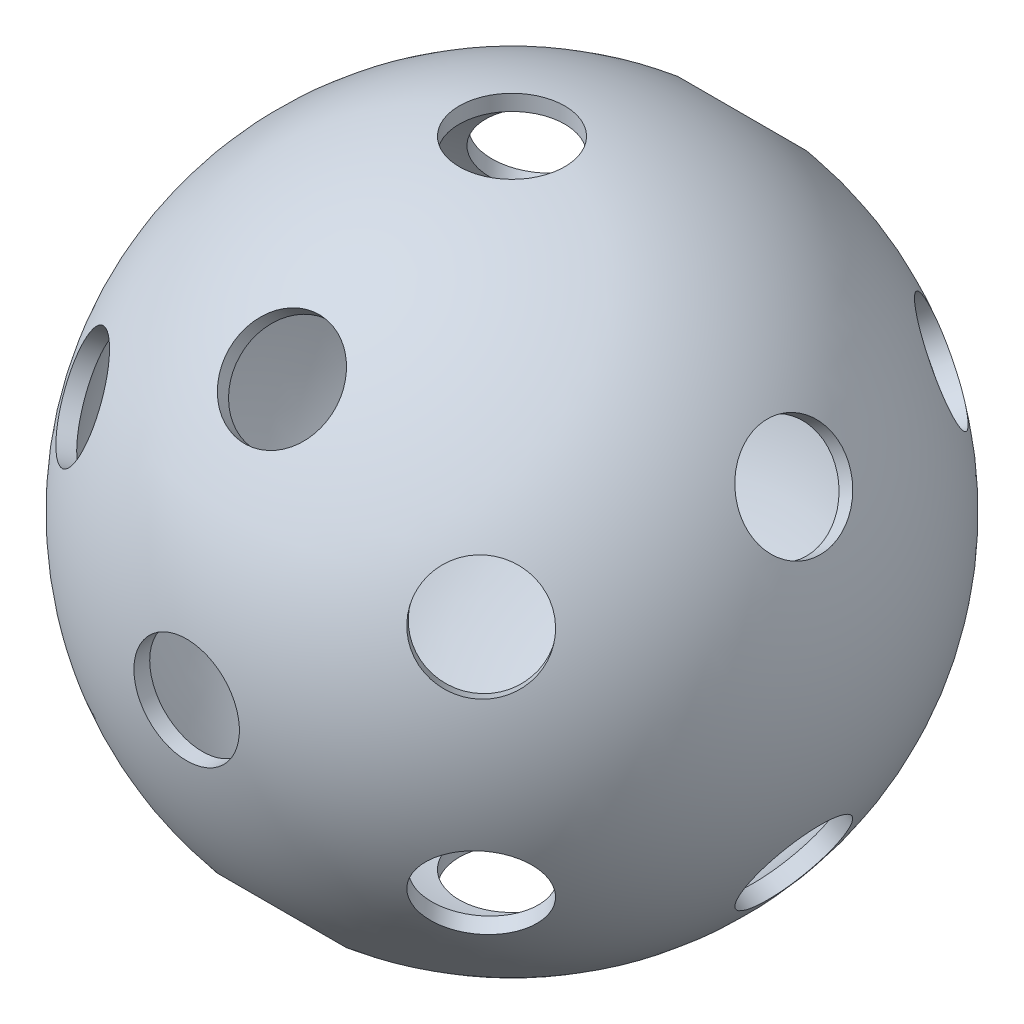
ISO-10303-21;
HEADER;
FILE_DESCRIPTION(('STEP AP214'),'2;1');
FILE_NAME('part.step','',(''),(''),'','','');
FILE_SCHEMA(('AUTOMOTIVE_DESIGN { 1 0 10303 214 1 1 1 1 }'));
ENDSEC;
DATA;
#1=APPLICATION_CONTEXT('core data for automotive mechanical design processes');
#2=APPLICATION_PROTOCOL_DEFINITION('international standard','automotive_design',2000,#1);
#3=PRODUCT_CONTEXT('',#1,'mechanical');
#4=PRODUCT('Part','Part','',(#3));
#5=PRODUCT_RELATED_PRODUCT_CATEGORY('part','',(#4));
#6=PRODUCT_DEFINITION_FORMATION('','',#4);
#7=PRODUCT_DEFINITION_CONTEXT('part definition',#1,'design');
#8=PRODUCT_DEFINITION('design','',#6,#7);
#9=PRODUCT_DEFINITION_SHAPE('','',#8);
#10=(LENGTH_UNIT() NAMED_UNIT(*) SI_UNIT(.MILLI.,.METRE.));
#11=(NAMED_UNIT(*) PLANE_ANGLE_UNIT() SI_UNIT($,.RADIAN.));
#12=(NAMED_UNIT(*) SI_UNIT($,.STERADIAN.) SOLID_ANGLE_UNIT());
#13=UNCERTAINTY_MEASURE_WITH_UNIT(LENGTH_MEASURE(1.E-05),#10,'distance_accuracy_value','');
#14=(GEOMETRIC_REPRESENTATION_CONTEXT(3) GLOBAL_UNCERTAINTY_ASSIGNED_CONTEXT((#13)) GLOBAL_UNIT_ASSIGNED_CONTEXT((#10,
#11,#12)) REPRESENTATION_CONTEXT('',''));
#15=CARTESIAN_POINT('',(0.,0.,0.));
#16=DIRECTION('',(0.,0.,1.));
#17=DIRECTION('',(1.,0.,0.));
#18=AXIS2_PLACEMENT_3D('',#15,#16,#17);
#19=CARTESIAN_POINT('',(0.,0.,0.));
#20=DIRECTION('',(0.,1.,0.));
#21=DIRECTION('',(1.,0.,0.));
#22=AXIS2_PLACEMENT_3D('',#19,#20,#21);
#23=SPHERICAL_SURFACE('',#22,60.5);
#24=CARTESIAN_POINT('',(0.,0.,59.6407947633162));
#25=DIRECTION('',(0.,0.,-1.));
#26=DIRECTION('',(-1.,0.,0.));
#27=AXIS2_PLACEMENT_3D('',#24,#25,#26);
#28=CIRCLE('',#27,10.16);
#29=CARTESIAN_POINT('',(-10.16,0.,59.6407947633162));
#30=VERTEX_POINT('',#29);
#31=EDGE_CURVE('E36',#30,#30,#28,.T.);
#32=ORIENTED_EDGE('',*,*,#31,.F.);
#33=EDGE_LOOP('',(#32));
#34=FACE_BOUND('',#33,.T.);
#35=CARTESIAN_POINT('',(0.,-42.1724104124961,42.1724104124959));
#36=DIRECTION('',(0.,0.707106781186549,-0.707106781186546));
#37=DIRECTION('',(-1.,0.,0.));
#38=AXIS2_PLACEMENT_3D('',#35,#36,#37);
#39=CIRCLE('',#38,10.16);
#40=CARTESIAN_POINT('',(-10.16,-42.1724104124961,42.1724104124959));
#41=VERTEX_POINT('',#40);
#42=EDGE_CURVE('E43',#41,#41,#39,.T.);
#43=ORIENTED_EDGE('',*,*,#42,.F.);
#44=EDGE_LOOP('',(#43));
#45=FACE_BOUND('',#44,.T.);
#46=CARTESIAN_POINT('',(0.,42.1724104124955,42.1724104124965));
#47=DIRECTION('',(0.,-0.707106781186539,-0.707106781186556));
#48=DIRECTION('',(-1.,0.,0.));
#49=AXIS2_PLACEMENT_3D('',#46,#47,#48);
#50=CIRCLE('',#49,10.16);
#51=CARTESIAN_POINT('',(-10.16,42.1724104124955,42.1724104124965));
#52=VERTEX_POINT('',#51);
#53=EDGE_CURVE('E51',#52,#52,#50,.T.);
#54=ORIENTED_EDGE('',*,*,#53,.F.);
#55=EDGE_LOOP('',(#54));
#56=FACE_BOUND('',#55,.T.);
#57=CARTESIAN_POINT('',(0.,59.6407947633162,6.17765271945768E-13));
#58=DIRECTION('',(0.,-1.,0.));
#59=DIRECTION('',(-1.,0.,0.));
#60=AXIS2_PLACEMENT_3D('',#57,#58,#59);
#61=CIRCLE('',#60,10.16);
#62=CARTESIAN_POINT('',(-10.16,59.6407947633162,6.19009513093701E-13));
#63=VERTEX_POINT('',#62);
#64=EDGE_CURVE('E59',#63,#63,#61,.T.);
#65=ORIENTED_EDGE('',*,*,#64,.F.);
#66=EDGE_LOOP('',(#65));
#67=FACE_BOUND('',#66,.T.);
#68=CARTESIAN_POINT('',(0.,42.1724104124963,-42.1724104124956));
#69=DIRECTION('',(0.,-0.707106781186554,0.707106781186541));
#70=DIRECTION('',(-1.,0.,0.));
#71=AXIS2_PLACEMENT_3D('',#68,#69,#70);
#72=CIRCLE('',#71,10.16);
#73=CARTESIAN_POINT('',(-10.16,42.1724104124963,-42.1724104124956));
#74=VERTEX_POINT('',#73);
#75=EDGE_CURVE('E65',#74,#74,#72,.T.);
#76=ORIENTED_EDGE('',*,*,#75,.F.);
#77=EDGE_LOOP('',(#76));
#78=FACE_BOUND('',#77,.T.);
#79=CARTESIAN_POINT('',(0.,0.,-59.6407947633162));
#80=DIRECTION('',(0.,0.,1.));
#81=DIRECTION('',(-1.,0.,0.));
#82=AXIS2_PLACEMENT_3D('',#79,#80,#81);
#83=CIRCLE('',#82,10.16);
#84=CARTESIAN_POINT('',(-10.16,0.,-59.6407947633162));
#85=VERTEX_POINT('',#84);
#86=EDGE_CURVE('E71',#85,#85,#83,.T.);
#87=ORIENTED_EDGE('',*,*,#86,.F.);
#88=EDGE_LOOP('',(#87));
#89=FACE_BOUND('',#88,.T.);
#90=CARTESIAN_POINT('',(0.,-42.1724104124958,-42.1724104124962));
#91=DIRECTION('',(0.,0.707106781186544,0.707106781186551));
#92=DIRECTION('',(-1.,0.,0.));
#93=AXIS2_PLACEMENT_3D('',#90,#91,#92);
#94=CIRCLE('',#93,10.16);
#95=CARTESIAN_POINT('',(-10.16,-42.1724104124958,-42.1724104124962));
#96=VERTEX_POINT('',#95);
#97=EDGE_CURVE('E77',#96,#96,#94,.T.);
#98=ORIENTED_EDGE('',*,*,#97,.F.);
#99=EDGE_LOOP('',(#98));
#100=FACE_BOUND('',#99,.T.);
#101=CARTESIAN_POINT('',(0.,-59.6407947633162,-2.01295828045984E-13));
#102=DIRECTION('',(0.,1.,0.));
#103=DIRECTION('',(-1.,0.,0.));
#104=AXIS2_PLACEMENT_3D('',#101,#102,#103);
#105=CIRCLE('',#104,10.16);
#106=CARTESIAN_POINT('',(-10.16,-59.6407947633162,-2.00051586898051E-13));
#107=VERTEX_POINT('',#106);
#108=EDGE_CURVE('E50',#107,#107,#105,.T.);
#109=ORIENTED_EDGE('',*,*,#108,.F.);
#110=EDGE_LOOP('',(#109));
#111=FACE_BOUND('',#110,.T.);
#112=CARTESIAN_POINT('',(51.6504433669258,-29.820397381658,-2.01295828045984E-13));
#113=DIRECTION('',(-0.86602540378444,0.499999999999998,0.));
#114=DIRECTION('',(-0.499999999999998,-0.86602540378444,0.));
#115=AXIS2_PLACEMENT_3D('',#112,#113,#114);
#116=CIRCLE('',#115,10.16);
#117=CARTESIAN_POINT('',(46.5704433669258,-38.6192154841079,-2.00051586898051E-13));
#118=VERTEX_POINT('',#117);
#119=EDGE_CURVE('E58',#118,#118,#116,.T.);
#120=ORIENTED_EDGE('',*,*,#119,.F.);
#121=EDGE_LOOP('',(#120));
#122=FACE_BOUND('',#121,.T.);
#123=CARTESIAN_POINT('',(-51.6504433669254,-29.8203973816587,-2.01295828045984E-13));
#124=DIRECTION('',(0.866025403784433,0.50000000000001,0.));
#125=DIRECTION('',(-0.50000000000001,0.866025403784433,0.));
#126=AXIS2_PLACEMENT_3D('',#123,#124,#125);
#127=CIRCLE('',#126,10.16);
#128=CARTESIAN_POINT('',(-56.7304433669255,-21.0215792792088,-2.00051586898051E-13));
#129=VERTEX_POINT('',#128);
#130=EDGE_CURVE('E93',#129,#129,#127,.T.);
#131=ORIENTED_EDGE('',*,*,#130,.F.);
#132=EDGE_LOOP('',(#131));
#133=FACE_BOUND('',#132,.T.);
#134=CARTESIAN_POINT('',(-51.650443366926,29.8203973816576,-2.01295828045984E-13));
#135=DIRECTION('',(0.866025403784443,-0.499999999999992,0.));
#136=DIRECTION('',(0.499999999999992,0.866025403784443,0.));
#137=AXIS2_PLACEMENT_3D('',#134,#135,#136);
#138=CIRCLE('',#137,10.16);
#139=CARTESIAN_POINT('',(-46.5704433669261,38.6192154841075,-2.00051586898051E-13));
#140=VERTEX_POINT('',#139);
#141=EDGE_CURVE('E101',#140,#140,#138,.T.);
#142=ORIENTED_EDGE('',*,*,#141,.F.);
#143=EDGE_LOOP('',(#142));
#144=FACE_BOUND('',#143,.T.);
#145=CARTESIAN_POINT('',(51.6504433669256,29.8203973816583,-2.01295828045984E-13));
#146=DIRECTION('',(-0.866025403784437,-0.500000000000004,0.));
#147=DIRECTION('',(0.500000000000004,-0.866025403784437,0.));
#148=AXIS2_PLACEMENT_3D('',#145,#146,#147);
#149=CIRCLE('',#148,10.16);
#150=CARTESIAN_POINT('',(56.7304433669256,21.0215792792084,-2.00051586898051E-13));
#151=VERTEX_POINT('',#150);
#152=EDGE_CURVE('E92',#151,#151,#149,.T.);
#153=ORIENTED_EDGE('',*,*,#152,.F.);
#154=EDGE_LOOP('',(#153));
#155=FACE_BOUND('',#154,.T.);
#156=CARTESIAN_POINT('',(36.522378756045,-21.0862052062479,42.1724104124959));
#157=DIRECTION('',(-0.612372435695796,0.353553390593273,-0.707106781186546));
#158=DIRECTION('',(-0.499999999999998,-0.86602540378444,0.));
#159=AXIS2_PLACEMENT_3D('',#156,#157,#158);
#160=CIRCLE('',#159,10.16);
#161=CARTESIAN_POINT('',(31.442378756045,-29.8850233086979,42.1724104124959));
#162=VERTEX_POINT('',#161);
#163=EDGE_CURVE('E100',#162,#162,#160,.T.);
#164=ORIENTED_EDGE('',*,*,#163,.F.);
#165=EDGE_LOOP('',(#164));
#166=FACE_BOUND('',#165,.T.);
#167=CARTESIAN_POINT('',(-36.5223787560447,-21.0862052062485,42.1724104124959));
#168=DIRECTION('',(0.612372435695791,0.353553390593282,-0.707106781186546));
#169=DIRECTION('',(-0.50000000000001,0.866025403784433,0.));
#170=AXIS2_PLACEMENT_3D('',#167,#168,#169);
#171=CIRCLE('',#170,10.16);
#172=CARTESIAN_POINT('',(-41.6023787560448,-12.2873871037986,42.1724104124959));
#173=VERTEX_POINT('',#172);
#174=EDGE_CURVE('E117',#173,#173,#171,.T.);
#175=ORIENTED_EDGE('',*,*,#174,.F.);
#176=EDGE_LOOP('',(#175));
#177=FACE_BOUND('',#176,.T.);
#178=CARTESIAN_POINT('',(-36.5223787560452,21.0862052062477,42.1724104124959));
#179=DIRECTION('',(0.612372435695799,-0.353553390593269,-0.707106781186546));
#180=DIRECTION('',(0.499999999999992,0.866025403784443,0.));
#181=AXIS2_PLACEMENT_3D('',#178,#179,#180);
#182=CIRCLE('',#181,10.16);
#183=CARTESIAN_POINT('',(-31.4423787560452,29.8850233086976,42.1724104124959));
#184=VERTEX_POINT('',#183);
#185=EDGE_CURVE('E125',#184,#184,#182,.T.);
#186=ORIENTED_EDGE('',*,*,#185,.F.);
#187=EDGE_LOOP('',(#186));
#188=FACE_BOUND('',#187,.T.);
#189=CARTESIAN_POINT('',(36.5223787560449,21.0862052062482,42.1724104124959));
#190=DIRECTION('',(-0.612372435695794,-0.353553390593277,-0.707106781186546));
#191=DIRECTION('',(0.500000000000004,-0.866025403784436,0.));
#192=AXIS2_PLACEMENT_3D('',#189,#190,#191);
#193=CIRCLE('',#192,10.16);
#194=CARTESIAN_POINT('',(41.6023787560449,12.2873871037983,42.1724104124959));
#195=VERTEX_POINT('',#194);
#196=EDGE_CURVE('E116',#195,#195,#193,.T.);
#197=ORIENTED_EDGE('',*,*,#196,.F.);
#198=EDGE_LOOP('',(#197));
#199=FACE_BOUND('',#198,.T.);
#200=CARTESIAN_POINT('',(-36.5223787560453,21.0862052062481,-42.1724104124956));
#201=DIRECTION('',(0.612372435695801,-0.353553390593275,0.707106781186541));
#202=DIRECTION('',(-0.499999999999998,-0.86602540378444,0.));
#203=AXIS2_PLACEMENT_3D('',#200,#201,#202);
#204=CIRCLE('',#203,10.16);
#205=CARTESIAN_POINT('',(-41.6023787560452,12.2873871037982,-42.1724104124956));
#206=VERTEX_POINT('',#205);
#207=EDGE_CURVE('E124',#206,#206,#204,.T.);
#208=ORIENTED_EDGE('',*,*,#207,.F.);
#209=EDGE_LOOP('',(#208));
#210=FACE_BOUND('',#209,.T.);
#211=CARTESIAN_POINT('',(36.522378756045,21.0862052062486,-42.1724104124956));
#212=DIRECTION('',(-0.612372435695796,-0.353553390593284,0.707106781186541));
#213=DIRECTION('',(-0.50000000000001,0.866025403784433,0.));
#214=AXIS2_PLACEMENT_3D('',#211,#212,#213);
#215=CIRCLE('',#214,10.16);
#216=CARTESIAN_POINT('',(31.4423787560449,29.8850233086985,-42.1724104124956));
#217=VERTEX_POINT('',#216);
#218=EDGE_CURVE('E141',#217,#217,#215,.T.);
#219=ORIENTED_EDGE('',*,*,#218,.F.);
#220=EDGE_LOOP('',(#219));
#221=FACE_BOUND('',#220,.T.);
#222=CARTESIAN_POINT('',(36.5223787560454,-21.0862052062478,-42.1724104124956));
#223=DIRECTION('',(-0.612372435695803,0.353553390593271,0.707106781186541));
#224=DIRECTION('',(0.499999999999992,0.866025403784443,0.));
#225=AXIS2_PLACEMENT_3D('',#222,#223,#224);
#226=CIRCLE('',#225,10.16);
#227=CARTESIAN_POINT('',(41.6023787560453,-12.2873871037979,-42.1724104124956));
#228=VERTEX_POINT('',#227);
#229=EDGE_CURVE('E148',#228,#228,#226,.T.);
#230=ORIENTED_EDGE('',*,*,#229,.F.);
#231=EDGE_LOOP('',(#230));
#232=FACE_BOUND('',#231,.T.);
#233=CARTESIAN_POINT('',(-36.5223787560451,-21.0862052062484,-42.1724104124956));
#234=DIRECTION('',(0.612372435695798,0.35355339059328,0.707106781186541));
#235=DIRECTION('',(0.500000000000004,-0.866025403784436,0.));
#236=AXIS2_PLACEMENT_3D('',#233,#234,#235);
#237=CIRCLE('',#236,10.16);
#238=CARTESIAN_POINT('',(-31.4423787560451,-29.8850233086982,-42.1724104124956));
#239=VERTEX_POINT('',#238);
#240=EDGE_CURVE('E140',#239,#239,#237,.T.);
#241=ORIENTED_EDGE('',*,*,#240,.F.);
#242=EDGE_LOOP('',(#241));
#243=FACE_BOUND('',#242,.T.);
#244=ADVANCED_FACE('F33',(#34,#45,#56,#67,#78,#89,#100,#111,#122,#133,#144,#155,#166,#177,#188,
#199,#210,#221,#232,#243),#23,.F.);
#245=CARTESIAN_POINT('',(0.,0.,0.));
#246=DIRECTION('',(0.,1.,0.));
#247=DIRECTION('',(1.,0.,0.));
#248=AXIS2_PLACEMENT_3D('',#245,#246,#247);
#249=SPHERICAL_SURFACE('',#248,63.5);
#250=CARTESIAN_POINT('',(38.3846863996574,-22.1614090256011,-44.3228180512021));
#251=DIRECTION('',(-0.612372435695803,0.353553390593271,0.707106781186541));
#252=DIRECTION('',(0.499999999999992,0.866025403784443,0.));
#253=AXIS2_PLACEMENT_3D('',#250,#251,#252);
#254=CIRCLE('',#253,10.16);
#255=CARTESIAN_POINT('',(43.4646863996573,-13.3625909231511,-44.3228180512021));
#256=VERTEX_POINT('',#255);
#257=EDGE_CURVE('E144',#256,#256,#254,.T.);
#258=ORIENTED_EDGE('',*,*,#257,.T.);
#259=EDGE_LOOP('',(#258));
#260=FACE_BOUND('',#259,.T.);
#261=CARTESIAN_POINT('',(-38.3846863996572,22.1614090256013,-44.3228180512021));
#262=DIRECTION('',(0.612372435695801,-0.353553390593275,0.707106781186541));
#263=DIRECTION('',(-0.499999999999998,-0.86602540378444,0.));
#264=AXIS2_PLACEMENT_3D('',#261,#262,#263);
#265=CIRCLE('',#264,10.16);
#266=CARTESIAN_POINT('',(-43.4646863996572,13.3625909231514,-44.3228180512021));
#267=VERTEX_POINT('',#266);
#268=EDGE_CURVE('E137',#267,#267,#265,.T.);
#269=ORIENTED_EDGE('',*,*,#268,.T.);
#270=EDGE_LOOP('',(#269));
#271=FACE_BOUND('',#270,.T.);
#272=CARTESIAN_POINT('',(-38.3846863996571,22.1614090256009,44.3228180512024));
#273=DIRECTION('',(0.612372435695799,-0.353553390593269,-0.707106781186546));
#274=DIRECTION('',(0.499999999999992,0.866025403784443,0.));
#275=AXIS2_PLACEMENT_3D('',#272,#273,#274);
#276=CIRCLE('',#275,10.16);
#277=CARTESIAN_POINT('',(-33.3046863996572,30.9602271280509,44.3228180512024));
#278=VERTEX_POINT('',#277);
#279=EDGE_CURVE('E120',#278,#278,#276,.T.);
#280=ORIENTED_EDGE('',*,*,#279,.T.);
#281=EDGE_LOOP('',(#280));
#282=FACE_BOUND('',#281,.T.);
#283=CARTESIAN_POINT('',(38.3846863996569,-22.1614090256012,44.3228180512024));
#284=DIRECTION('',(-0.612372435695796,0.353553390593273,-0.707106781186546));
#285=DIRECTION('',(-0.499999999999998,-0.86602540378444,0.));
#286=AXIS2_PLACEMENT_3D('',#283,#284,#285);
#287=CIRCLE('',#286,10.16);
#288=CARTESIAN_POINT('',(33.304686399657,-30.9602271280511,44.3228180512024));
#289=VERTEX_POINT('',#288);
#290=EDGE_CURVE('E113',#289,#289,#287,.T.);
#291=ORIENTED_EDGE('',*,*,#290,.T.);
#292=EDGE_LOOP('',(#291));
#293=FACE_BOUND('',#292,.T.);
#294=CARTESIAN_POINT('',(-54.2841440938331,31.3409652053023,-2.11913896407386E-13));
#295=DIRECTION('',(0.866025403784443,-0.499999999999992,0.));
#296=DIRECTION('',(0.499999999999992,0.866025403784443,0.));
#297=AXIS2_PLACEMENT_3D('',#294,#295,#296);
#298=CIRCLE('',#297,10.16);
#299=CARTESIAN_POINT('',(-49.2041440938331,40.1397833077522,-2.10669655259452E-13));
#300=VERTEX_POINT('',#299);
#301=EDGE_CURVE('E96',#300,#300,#298,.T.);
#302=ORIENTED_EDGE('',*,*,#301,.T.);
#303=EDGE_LOOP('',(#302));
#304=FACE_BOUND('',#303,.T.);
#305=CARTESIAN_POINT('',(54.2841440938328,-31.3409652053027,-2.11913896407386E-13));
#306=DIRECTION('',(-0.86602540378444,0.499999999999998,0.));
#307=DIRECTION('',(-0.499999999999998,-0.86602540378444,0.));
#308=AXIS2_PLACEMENT_3D('',#305,#306,#307);
#309=CIRCLE('',#308,10.16);
#310=CARTESIAN_POINT('',(49.2041440938329,-40.1397833077526,-2.10669655259452E-13));
#311=VERTEX_POINT('',#310);
#312=EDGE_CURVE('E89',#311,#311,#309,.T.);
#313=ORIENTED_EDGE('',*,*,#312,.T.);
#314=EDGE_LOOP('',(#313));
#315=FACE_BOUND('',#314,.T.);
#316=CARTESIAN_POINT('',(0.,-44.3228180512022,-44.3228180512027));
#317=DIRECTION('',(0.,0.707106781186544,0.707106781186551));
#318=DIRECTION('',(-1.,0.,0.));
#319=AXIS2_PLACEMENT_3D('',#316,#317,#318);
#320=CIRCLE('',#319,10.16);
#321=CARTESIAN_POINT('',(-10.16,-44.3228180512022,-44.3228180512027));
#322=VERTEX_POINT('',#321);
#323=EDGE_CURVE('E74',#322,#322,#320,.T.);
#324=ORIENTED_EDGE('',*,*,#323,.T.);
#325=EDGE_LOOP('',(#324));
#326=FACE_BOUND('',#325,.T.);
#327=CARTESIAN_POINT('',(0.,44.3228180512029,-44.3228180512021));
#328=DIRECTION('',(0.,-0.707106781186554,0.707106781186541));
#329=DIRECTION('',(-1.,0.,0.));
#330=AXIS2_PLACEMENT_3D('',#327,#328,#329);
#331=CIRCLE('',#330,10.16);
#332=CARTESIAN_POINT('',(-10.16,44.3228180512029,-44.3228180512021));
#333=VERTEX_POINT('',#332);
#334=EDGE_CURVE('E62',#333,#333,#331,.T.);
#335=ORIENTED_EDGE('',*,*,#334,.T.);
#336=EDGE_LOOP('',(#335));
#337=FACE_BOUND('',#336,.T.);
#338=CARTESIAN_POINT('',(0.,44.3228180512019,44.322818051203));
#339=DIRECTION('',(0.,-0.707106781186539,-0.707106781186556));
#340=DIRECTION('',(-1.,0.,0.));
#341=AXIS2_PLACEMENT_3D('',#338,#339,#340);
#342=CIRCLE('',#341,10.16);
#343=CARTESIAN_POINT('',(-10.16,44.3228180512019,44.322818051203));
#344=VERTEX_POINT('',#343);
#345=EDGE_CURVE('E55',#344,#344,#342,.T.);
#346=ORIENTED_EDGE('',*,*,#345,.T.);
#347=EDGE_LOOP('',(#346));
#348=FACE_BOUND('',#347,.T.);
#349=CARTESIAN_POINT('',(0.,0.,62.6819304106056));
#350=DIRECTION('',(0.,0.,-1.));
#351=DIRECTION('',(-1.,0.,0.));
#352=AXIS2_PLACEMENT_3D('',#349,#350,#351);
#353=CIRCLE('',#352,10.16);
#354=CARTESIAN_POINT('',(-10.16,0.,62.6819304106056));
#355=VERTEX_POINT('',#354);
#356=EDGE_CURVE('E10',#355,#355,#353,.T.);
#357=ORIENTED_EDGE('',*,*,#356,.T.);
#358=EDGE_LOOP('',(#357));
#359=FACE_BOUND('',#358,.T.);
#360=CARTESIAN_POINT('',(0.,-44.3228180512025,44.3228180512024));
#361=DIRECTION('',(0.,0.707106781186549,-0.707106781186546));
#362=DIRECTION('',(-1.,0.,0.));
#363=AXIS2_PLACEMENT_3D('',#360,#361,#362);
#364=CIRCLE('',#363,10.16);
#365=CARTESIAN_POINT('',(-10.16,-44.3228180512025,44.3228180512024));
#366=VERTEX_POINT('',#365);
#367=EDGE_CURVE('E47',#366,#366,#364,.T.);
#368=ORIENTED_EDGE('',*,*,#367,.T.);
#369=EDGE_LOOP('',(#368));
#370=FACE_BOUND('',#369,.T.);
#371=CARTESIAN_POINT('',(0.,62.6819304106056,6.49619477029973E-13));
#372=DIRECTION('',(0.,-1.,0.));
#373=DIRECTION('',(-1.,0.,0.));
#374=AXIS2_PLACEMENT_3D('',#371,#372,#373);
#375=CIRCLE('',#374,10.16);
#376=CARTESIAN_POINT('',(-10.16,62.6819304106056,6.50863718177906E-13));
#377=VERTEX_POINT('',#376);
#378=EDGE_CURVE('E54',#377,#377,#375,.T.);
#379=ORIENTED_EDGE('',*,*,#378,.T.);
#380=EDGE_LOOP('',(#379));
#381=FACE_BOUND('',#380,.T.);
#382=CARTESIAN_POINT('',(0.,0.,-62.6819304106056));
#383=DIRECTION('',(0.,0.,1.));
#384=DIRECTION('',(-1.,0.,0.));
#385=AXIS2_PLACEMENT_3D('',#382,#383,#384);
#386=CIRCLE('',#385,10.16);
#387=CARTESIAN_POINT('',(-10.16,0.,-62.6819304106056));
#388=VERTEX_POINT('',#387);
#389=EDGE_CURVE('E68',#388,#388,#386,.T.);
#390=ORIENTED_EDGE('',*,*,#389,.T.);
#391=EDGE_LOOP('',(#390));
#392=FACE_BOUND('',#391,.T.);
#393=CARTESIAN_POINT('',(0.,-62.6819304106056,-2.11913896407386E-13));
#394=DIRECTION('',(0.,1.,0.));
#395=DIRECTION('',(-1.,0.,0.));
#396=AXIS2_PLACEMENT_3D('',#393,#394,#395);
#397=CIRCLE('',#396,10.16);
#398=CARTESIAN_POINT('',(-10.16,-62.6819304106056,-2.10669655259452E-13));
#399=VERTEX_POINT('',#398);
#400=EDGE_CURVE('E80',#399,#399,#397,.T.);
#401=ORIENTED_EDGE('',*,*,#400,.T.);
#402=EDGE_LOOP('',(#401));
#403=FACE_BOUND('',#402,.T.);
#404=CARTESIAN_POINT('',(-54.2841440938324,-31.3409652053034,-2.11913896407386E-13));
#405=DIRECTION('',(0.866025403784433,0.50000000000001,0.));
#406=DIRECTION('',(-0.50000000000001,0.866025403784433,0.));
#407=AXIS2_PLACEMENT_3D('',#404,#405,#406);
#408=CIRCLE('',#407,10.16);
#409=CARTESIAN_POINT('',(-59.3641440938325,-22.5421471028536,-2.10669655259452E-13));
#410=VERTEX_POINT('',#409);
#411=EDGE_CURVE('E97',#410,#410,#408,.T.);
#412=ORIENTED_EDGE('',*,*,#411,.T.);
#413=EDGE_LOOP('',(#412));
#414=FACE_BOUND('',#413,.T.);
#415=CARTESIAN_POINT('',(54.2841440938327,31.340965205303,-2.11913896407386E-13));
#416=DIRECTION('',(-0.866025403784437,-0.500000000000004,0.));
#417=DIRECTION('',(0.500000000000004,-0.866025403784437,0.));
#418=AXIS2_PLACEMENT_3D('',#415,#416,#417);
#419=CIRCLE('',#418,10.16);
#420=CARTESIAN_POINT('',(59.3641440938327,22.5421471028532,-2.10669655259452E-13));
#421=VERTEX_POINT('',#420);
#422=EDGE_CURVE('E104',#421,#421,#419,.T.);
#423=ORIENTED_EDGE('',*,*,#422,.T.);
#424=EDGE_LOOP('',(#423));
#425=FACE_BOUND('',#424,.T.);
#426=CARTESIAN_POINT('',(-38.3846863996566,-22.1614090256017,44.3228180512024));
#427=DIRECTION('',(0.612372435695791,0.353553390593282,-0.707106781186546));
#428=DIRECTION('',(-0.50000000000001,0.866025403784433,0.));
#429=AXIS2_PLACEMENT_3D('',#426,#427,#428);
#430=CIRCLE('',#429,10.16);
#431=CARTESIAN_POINT('',(-43.4646863996567,-13.3625909231519,44.3228180512024));
#432=VERTEX_POINT('',#431);
#433=EDGE_CURVE('E121',#432,#432,#430,.T.);
#434=ORIENTED_EDGE('',*,*,#433,.T.);
#435=EDGE_LOOP('',(#434));
#436=FACE_BOUND('',#435,.T.);
#437=CARTESIAN_POINT('',(38.3846863996568,22.1614090256015,44.3228180512024));
#438=DIRECTION('',(-0.612372435695794,-0.353553390593277,-0.707106781186546));
#439=DIRECTION('',(0.500000000000004,-0.866025403784436,0.));
#440=AXIS2_PLACEMENT_3D('',#437,#438,#439);
#441=CIRCLE('',#440,10.16);
#442=CARTESIAN_POINT('',(43.4646863996568,13.3625909231516,44.3228180512024));
#443=VERTEX_POINT('',#442);
#444=EDGE_CURVE('E128',#443,#443,#441,.T.);
#445=ORIENTED_EDGE('',*,*,#444,.T.);
#446=EDGE_LOOP('',(#445));
#447=FACE_BOUND('',#446,.T.);
#448=CARTESIAN_POINT('',(38.3846863996569,22.1614090256019,-44.3228180512021));
#449=DIRECTION('',(-0.612372435695796,-0.353553390593284,0.707106781186541));
#450=DIRECTION('',(-0.50000000000001,0.866025403784433,0.));
#451=AXIS2_PLACEMENT_3D('',#448,#449,#450);
#452=CIRCLE('',#451,10.16);
#453=CARTESIAN_POINT('',(33.3046863996568,30.9602271280517,-44.3228180512021));
#454=VERTEX_POINT('',#453);
#455=EDGE_CURVE('E145',#454,#454,#452,.T.);
#456=ORIENTED_EDGE('',*,*,#455,.T.);
#457=EDGE_LOOP('',(#456));
#458=FACE_BOUND('',#457,.T.);
#459=CARTESIAN_POINT('',(-38.3846863996571,-22.1614090256016,-44.3228180512021));
#460=DIRECTION('',(0.612372435695798,0.35355339059328,0.707106781186541));
#461=DIRECTION('',(0.500000000000004,-0.866025403784436,0.));
#462=AXIS2_PLACEMENT_3D('',#459,#460,#461);
#463=CIRCLE('',#462,10.16);
#464=CARTESIAN_POINT('',(-33.304686399657,-30.9602271280515,-44.3228180512021));
#465=VERTEX_POINT('',#464);
#466=EDGE_CURVE('E151',#465,#465,#463,.T.);
#467=ORIENTED_EDGE('',*,*,#466,.T.);
#468=EDGE_LOOP('',(#467));
#469=FACE_BOUND('',#468,.T.);
#470=ADVANCED_FACE('F159',(#260,#271,#282,#293,#304,#315,#326,#337,#348,#359,#370,#381,#392,
#403,#414,#425,#436,#447,#458,#469),#249,.T.);
#471=CARTESIAN_POINT('',(0.,0.,63.5));
#472=DIRECTION('',(0.,0.,-1.));
#473=DIRECTION('',(-1.,0.,0.));
#474=AXIS2_PLACEMENT_3D('',#471,#472,#473);
#475=CYLINDRICAL_SURFACE('',#474,10.16);
#476=ORIENTED_EDGE('',*,*,#356,.F.);
#477=EDGE_LOOP('',(#476));
#478=FACE_BOUND('',#477,.T.);
#479=ORIENTED_EDGE('',*,*,#31,.T.);
#480=EDGE_LOOP('',(#479));
#481=FACE_BOUND('',#480,.T.);
#482=ADVANCED_FACE('F173',(#478,#481),#475,.F.);
#483=CARTESIAN_POINT('',(0.,-44.9012806053458,44.9012806053457));
#484=DIRECTION('',(0.,0.707106781186549,-0.707106781186546));
#485=DIRECTION('',(-1.,0.,0.));
#486=AXIS2_PLACEMENT_3D('',#483,#484,#485);
#487=CYLINDRICAL_SURFACE('',#486,10.16);
#488=ORIENTED_EDGE('',*,*,#367,.F.);
#489=EDGE_LOOP('',(#488));
#490=FACE_BOUND('',#489,.T.);
#491=ORIENTED_EDGE('',*,*,#42,.T.);
#492=EDGE_LOOP('',(#491));
#493=FACE_BOUND('',#492,.T.);
#494=ADVANCED_FACE('F283',(#490,#493),#487,.F.);
#495=CARTESIAN_POINT('',(0.,44.9012806053452,44.9012806053463));
#496=DIRECTION('',(0.,-0.707106781186539,-0.707106781186556));
#497=DIRECTION('',(-1.,0.,0.));
#498=AXIS2_PLACEMENT_3D('',#495,#496,#497);
#499=CYLINDRICAL_SURFACE('',#498,10.16);
#500=ORIENTED_EDGE('',*,*,#345,.F.);
#501=EDGE_LOOP('',(#500));
#502=FACE_BOUND('',#501,.T.);
#503=ORIENTED_EDGE('',*,*,#53,.T.);
#504=EDGE_LOOP('',(#503));
#505=FACE_BOUND('',#504,.T.);
#506=ADVANCED_FACE('F279',(#502,#505),#499,.F.);
#507=CARTESIAN_POINT('',(0.,63.5,6.5818830114571E-13));
#508=DIRECTION('',(0.,-1.,0.));
#509=DIRECTION('',(-1.,0.,0.));
#510=AXIS2_PLACEMENT_3D('',#507,#508,#509);
#511=CYLINDRICAL_SURFACE('',#510,10.16);
#512=ORIENTED_EDGE('',*,*,#378,.F.);
#513=EDGE_LOOP('',(#512));
#514=FACE_BOUND('',#513,.T.);
#515=ORIENTED_EDGE('',*,*,#64,.T.);
#516=EDGE_LOOP('',(#515));
#517=FACE_BOUND('',#516,.T.);
#518=ADVANCED_FACE('F275',(#514,#517),#511,.F.);
#519=CARTESIAN_POINT('',(0.,44.9012806053462,-44.9012806053454));
#520=DIRECTION('',(0.,-0.707106781186554,0.707106781186541));
#521=DIRECTION('',(-1.,0.,0.));
#522=AXIS2_PLACEMENT_3D('',#519,#520,#521);
#523=CYLINDRICAL_SURFACE('',#522,10.16);
#524=ORIENTED_EDGE('',*,*,#334,.F.);
#525=EDGE_LOOP('',(#524));
#526=FACE_BOUND('',#525,.T.);
#527=ORIENTED_EDGE('',*,*,#75,.T.);
#528=EDGE_LOOP('',(#527));
#529=FACE_BOUND('',#528,.T.);
#530=ADVANCED_FACE('F271',(#526,#529),#523,.F.);
#531=CARTESIAN_POINT('',(0.,0.,-63.5));
#532=DIRECTION('',(0.,0.,1.));
#533=DIRECTION('',(-1.,0.,0.));
#534=AXIS2_PLACEMENT_3D('',#531,#532,#533);
#535=CYLINDRICAL_SURFACE('',#534,10.16);
#536=ORIENTED_EDGE('',*,*,#389,.F.);
#537=EDGE_LOOP('',(#536));
#538=FACE_BOUND('',#537,.T.);
#539=ORIENTED_EDGE('',*,*,#86,.T.);
#540=EDGE_LOOP('',(#539));
#541=FACE_BOUND('',#540,.T.);
#542=ADVANCED_FACE('F267',(#538,#541),#535,.F.);
#543=CARTESIAN_POINT('',(0.,-44.9012806053455,-44.901280605346));
#544=DIRECTION('',(0.,0.707106781186544,0.707106781186551));
#545=DIRECTION('',(-1.,0.,0.));
#546=AXIS2_PLACEMENT_3D('',#543,#544,#545);
#547=CYLINDRICAL_SURFACE('',#546,10.16);
#548=ORIENTED_EDGE('',*,*,#323,.F.);
#549=EDGE_LOOP('',(#548));
#550=FACE_BOUND('',#549,.T.);
#551=ORIENTED_EDGE('',*,*,#97,.T.);
#552=EDGE_LOOP('',(#551));
#553=FACE_BOUND('',#552,.T.);
#554=ADVANCED_FACE('F263',(#550,#553),#547,.F.);
#555=CARTESIAN_POINT('',(0.,-63.5,-2.14770171112632E-13));
#556=DIRECTION('',(0.,1.,0.));
#557=DIRECTION('',(-1.,0.,0.));
#558=AXIS2_PLACEMENT_3D('',#555,#556,#557);
#559=CYLINDRICAL_SURFACE('',#558,10.16);
#560=ORIENTED_EDGE('',*,*,#400,.F.);
#561=EDGE_LOOP('',(#560));
#562=FACE_BOUND('',#561,.T.);
#563=ORIENTED_EDGE('',*,*,#108,.T.);
#564=EDGE_LOOP('',(#563));
#565=FACE_BOUND('',#564,.T.);
#566=ADVANCED_FACE('F259',(#562,#565),#559,.F.);
#567=CARTESIAN_POINT('',(54.9926131403119,-31.7499999999999,-2.14770171112632E-13));
#568=DIRECTION('',(-0.86602540378444,0.499999999999998,0.));
#569=DIRECTION('',(-0.499999999999998,-0.86602540378444,0.));
#570=AXIS2_PLACEMENT_3D('',#567,#568,#569);
#571=CYLINDRICAL_SURFACE('',#570,10.16);
#572=ORIENTED_EDGE('',*,*,#312,.F.);
#573=EDGE_LOOP('',(#572));
#574=FACE_BOUND('',#573,.T.);
#575=ORIENTED_EDGE('',*,*,#119,.T.);
#576=EDGE_LOOP('',(#575));
#577=FACE_BOUND('',#576,.T.);
#578=ADVANCED_FACE('F255',(#574,#577),#571,.F.);
#579=CARTESIAN_POINT('',(-54.9926131403115,-31.7500000000006,-2.14770171112632E-13));
#580=DIRECTION('',(0.866025403784433,0.50000000000001,0.));
#581=DIRECTION('',(-0.50000000000001,0.866025403784433,0.));
#582=AXIS2_PLACEMENT_3D('',#579,#580,#581);
#583=CYLINDRICAL_SURFACE('',#582,10.16);
#584=ORIENTED_EDGE('',*,*,#411,.F.);
#585=EDGE_LOOP('',(#584));
#586=FACE_BOUND('',#585,.T.);
#587=ORIENTED_EDGE('',*,*,#130,.T.);
#588=EDGE_LOOP('',(#587));
#589=FACE_BOUND('',#588,.T.);
#590=ADVANCED_FACE('F251',(#586,#589),#583,.F.);
#591=CARTESIAN_POINT('',(-54.9926131403121,31.7499999999995,-2.14770171112632E-13));
#592=DIRECTION('',(0.866025403784443,-0.499999999999992,0.));
#593=DIRECTION('',(0.499999999999992,0.866025403784443,0.));
#594=AXIS2_PLACEMENT_3D('',#591,#592,#593);
#595=CYLINDRICAL_SURFACE('',#594,10.16);
#596=CARTESIAN_POINT('',(-49.2041440938331,40.1397833077522,-2.10669655259452E-13));
#597=CARTESIAN_POINT('',(-49.1767097112612,40.1239440595893,-2.10559050380688E-13));
#598=CARTESIAN_POINT('',(-49.1492753286892,40.1081048114263,-2.10448445501923E-13));
#599=CARTESIAN_POINT('',(-49.0944065635453,40.0764263151004,-2.10227235744394E-13));
#600=CARTESIAN_POINT('',(-49.0669721809734,40.0605870669374,-2.10116630865629E-13));
#601=CARTESIAN_POINT('',(-49.0121034158295,40.0289085706115,-2.098954211081E-13));
#602=CARTESIAN_POINT('',(-48.9846690332575,40.0130693224485,-2.09784816229336E-13));
#603=CARTESIAN_POINT('',(-48.9298002681137,39.9813908261226,-2.09563606471806E-13));
#604=CARTESIAN_POINT('',(-48.9023658855417,39.9655515779596,-2.09453001593042E-13));
#605=CARTESIAN_POINT('',(-48.8474971203978,39.9338730816337,-2.09231791835512E-13));
#606=CARTESIAN_POINT('',(-48.8200627378259,39.9180338334707,-2.09121186956748E-13));
#607=CARTESIAN_POINT('',(-48.765193972682,39.8863553371448,-2.08899977199219E-13));
#608=CARTESIAN_POINT('',(-48.73775959011,39.8705160889818,-2.08789372320454E-13));
#609=CARTESIAN_POINT('',(-48.6828908249661,39.8388375926559,-2.08568162562925E-13));
#610=CARTESIAN_POINT('',(-48.6554564423942,39.8229983444929,-2.0845755768416E-13));
#611=CARTESIAN_POINT('',(-48.6005876772503,39.791319848167,-2.08236347926631E-13));
#612=CARTESIAN_POINT('',(-48.5731532946783,39.775480600004,-2.08125743047866E-13));
#613=CARTESIAN_POINT('',(-48.5182845295344,39.7438021036781,-2.07904533290337E-13));
#614=CARTESIAN_POINT('',(-48.4908501469625,39.7279628555151,-2.07793928411573E-13));
#615=CARTESIAN_POINT('',(-48.4359813818186,39.6962843591892,-2.07572718654044E-13));
#616=CARTESIAN_POINT('',(-48.4085469992466,39.6804451110262,-2.07462113775279E-13));
#617=CARTESIAN_POINT('',(-48.3536782341027,39.6487666147003,-2.0724090401775E-13));
#618=CARTESIAN_POINT('',(-48.3262438515308,39.6329273665373,-2.07130299138985E-13));
#619=CARTESIAN_POINT('',(-48.2713750863869,39.6012488702114,-2.06909089381456E-13));
#620=CARTESIAN_POINT('',(-48.2439407038149,39.5854096220484,-2.06798484502691E-13));
#621=CARTESIAN_POINT('',(-48.189071938671,39.5537311257225,-2.06577274745162E-13));
#622=CARTESIAN_POINT('',(-48.1616375560991,39.5378918775595,-2.06466669866397E-13));
#623=CARTESIAN_POINT('',(-48.1067687909552,39.5062133812336,-2.06245460108868E-13));
#624=CARTESIAN_POINT('',(-48.0793344083832,39.4903741330706,-2.06134855230104E-13));
#625=CARTESIAN_POINT('',(-48.0244656432393,39.4586956367447,-2.05913645472574E-13));
#626=CARTESIAN_POINT('',(-47.9970312606674,39.4428563885817,-2.0580304059381E-13));
#627=CARTESIAN_POINT('',(-47.9421624955235,39.4111778922558,-2.05581830836281E-13));
#628=CARTESIAN_POINT('',(-47.9147281129516,39.3953386440929,-2.05471225957516E-13));
#629=CARTESIAN_POINT('',(-47.8598593478077,39.3636601477669,-2.05250016199987E-13));
#630=CARTESIAN_POINT('',(-47.8324249652357,39.347820899604,-2.05139411321222E-13));
#631=CARTESIAN_POINT('',(-47.7775562000918,39.316142403278,-2.04918201563693E-13));
#632=CARTESIAN_POINT('',(-47.7501218175199,39.3003031551151,-2.04807596684929E-13));
#633=CARTESIAN_POINT('',(-47.695253052376,39.2686246587891,-2.04586386927399E-13));
#634=CARTESIAN_POINT('',(-47.667818669804,39.2527854106262,-2.04475782048635E-13));
#635=CARTESIAN_POINT('',(-47.6129499046601,39.2211069143002,-2.04254572291105E-13));
#636=CARTESIAN_POINT('',(-47.5855155220882,39.2052676661373,-2.04143967412341E-13));
#637=CARTESIAN_POINT('',(-47.5306467569443,39.1735891698113,-2.03922757654812E-13));
#638=CARTESIAN_POINT('',(-47.5032123743723,39.1577499216484,-2.03812152776047E-13));
#639=CARTESIAN_POINT('',(-47.4483436092284,39.1260714253224,-2.03590943018518E-13));
#640=CARTESIAN_POINT('',(-47.4209092266565,39.1102321771595,-2.03480338139753E-13));
#641=CARTESIAN_POINT('',(-47.3660404615126,39.0785536808335,-2.03259128382224E-13));
#642=CARTESIAN_POINT('',(-47.3386060789406,39.0627144326706,-2.0314852350346E-13));
#643=CARTESIAN_POINT('',(-47.2837373137967,39.0310359363446,-2.0292731374593E-13));
#644=CARTESIAN_POINT('',(-47.2563029312248,39.0151966881817,-2.02816708867166E-13));
#645=CARTESIAN_POINT('',(-47.2014341660809,38.9835181918558,-2.02595499109636E-13));
#646=CARTESIAN_POINT('',(-47.1739997835089,38.9676789436928,-2.02484894230872E-13));
#647=CARTESIAN_POINT('',(-47.119131018365,38.9360004473669,-2.02263684473343E-13));
#648=CARTESIAN_POINT('',(-47.0916966357931,38.9201611992039,-2.02153079594578E-13));
#649=CARTESIAN_POINT('',(-47.0368278706492,38.888482702878,-2.01931869837049E-13));
#650=CARTESIAN_POINT('',(-47.0093934880772,38.872643454715,-2.01821264958284E-13));
#651=CARTESIAN_POINT('',(-46.9545247229333,38.8409649583891,-2.01600055200755E-13));
#652=CARTESIAN_POINT('',(-46.9270903403614,38.8251257102261,-2.0148945032199E-13));
#653=CARTESIAN_POINT('',(-46.8722215752175,38.7934472139002,-2.01268240564461E-13));
#654=CARTESIAN_POINT('',(-46.8447871926455,38.7776079657372,-2.01157635685697E-13));
#655=CARTESIAN_POINT('',(-46.7899184275017,38.7459294694113,-2.00936425928167E-13));
#656=CARTESIAN_POINT('',(-46.7624840449297,38.7300902212483,-2.00825821049403E-13));
#657=CARTESIAN_POINT('',(-46.7076152797858,38.6984117249224,-2.00604611291874E-13));
#658=CARTESIAN_POINT('',(-46.6801808972139,38.6825724767594,-2.00494006413109E-13));
#659=CARTESIAN_POINT('',(-46.62531213207,38.6508939804335,-2.0027279665558E-13));
#660=CARTESIAN_POINT('',(-46.597877749498,38.6350547322705,-2.00162191776815E-13));
#661=CARTESIAN_POINT('',(-46.5704433669261,38.6192154841075,-2.00051586898051E-13));
#662=B_SPLINE_CURVE_WITH_KNOTS('',3,(#596,#597,#598,#599,#600,#601,#602,#603,#604,#605,#606,
#607,#608,#609,#610,#611,#612,#613,#614,#615,#616,#617,#618,#619,#620,#621,#622,#623,#624,#625,
#626,#627,#628,#629,#630,#631,#632,#633,#634,#635,#636,#637,#638,#639,#640,#641,#642,#643,#644,
#645,#646,#647,#648,#649,#650,#651,#652,#653,#654,#655,#656,#657,#658,#659,#660,#661),
.UNSPECIFIED.,.F.,.F.,(4,2,2,2,2,2,2,2,2,2,2,2,2,2,2,2,2,2,2,2,2,2,2,2,2,2,2,2,2,2,2,2,4),(0.,
0.0950354889777943,0.190070977955589,0.285106466933383,0.380141955911174,0.475177444888968,
0.570212933866762,0.665248422844556,0.760283911822347,0.855319400800148,0.950354889777942,
1.04539037875574,1.14042586773353,1.23546135671132,1.33049684568912,1.42553233466691,
1.5205678236447,1.61560331262249,1.7106388016003,1.80567429057809,1.90070977955588,
1.99574526853367,2.09078075751147,2.18581624648926,2.28085173546705,2.37588722444485,
2.47092271342265,2.56595820240044,2.66099369137823,2.75602918035603,2.85106466933382,
2.94610015831162,3.04113564728941),.UNSPECIFIED.);
#663=EDGE_CURVE('BSEAM247',#300,#140,#662,.T.);
#664=ORIENTED_EDGE('',*,*,#301,.F.);
#665=ORIENTED_EDGE('',*,*,#141,.T.);
#666=ORIENTED_EDGE('',*,*,#663,.T.);
#667=ORIENTED_EDGE('',*,*,#663,.F.);
#668=EDGE_LOOP('',(#664,#666,#665,#667));
#669=FACE_BOUND('',#668,.T.);
#670=ADVANCED_FACE('F247',(#669),#595,.F.);
#671=CARTESIAN_POINT('',(54.9926131403117,31.7500000000003,-2.14770171112632E-13));
#672=DIRECTION('',(-0.866025403784437,-0.500000000000004,0.));
#673=DIRECTION('',(0.500000000000004,-0.866025403784437,0.));
#674=AXIS2_PLACEMENT_3D('',#671,#672,#673);
#675=CYLINDRICAL_SURFACE('',#674,10.16);
#676=ORIENTED_EDGE('',*,*,#422,.F.);
#677=EDGE_LOOP('',(#676));
#678=FACE_BOUND('',#677,.T.);
#679=ORIENTED_EDGE('',*,*,#152,.T.);
#680=EDGE_LOOP('',(#679));
#681=FACE_BOUND('',#680,.T.);
#682=ADVANCED_FACE('F243',(#678,#681),#675,.F.);
#683=CARTESIAN_POINT('',(38.8856496666831,-22.4506403026728,44.9012806053457));
#684=DIRECTION('',(-0.612372435695796,0.353553390593273,-0.707106781186546));
#685=DIRECTION('',(-0.499999999999998,-0.86602540378444,0.));
#686=AXIS2_PLACEMENT_3D('',#683,#684,#685);
#687=CYLINDRICAL_SURFACE('',#686,10.16);
#688=ORIENTED_EDGE('',*,*,#290,.F.);
#689=EDGE_LOOP('',(#688));
#690=FACE_BOUND('',#689,.T.);
#691=ORIENTED_EDGE('',*,*,#163,.T.);
#692=EDGE_LOOP('',(#691));
#693=FACE_BOUND('',#692,.T.);
#694=ADVANCED_FACE('F239',(#690,#693),#687,.F.);
#695=CARTESIAN_POINT('',(-38.8856496666828,-22.4506403026734,44.9012806053457));
#696=DIRECTION('',(0.612372435695791,0.353553390593282,-0.707106781186546));
#697=DIRECTION('',(-0.50000000000001,0.866025403784433,0.));
#698=AXIS2_PLACEMENT_3D('',#695,#696,#697);
#699=CYLINDRICAL_SURFACE('',#698,10.16);
#700=ORIENTED_EDGE('',*,*,#433,.F.);
#701=EDGE_LOOP('',(#700));
#702=FACE_BOUND('',#701,.T.);
#703=ORIENTED_EDGE('',*,*,#174,.T.);
#704=EDGE_LOOP('',(#703));
#705=FACE_BOUND('',#704,.T.);
#706=ADVANCED_FACE('F235',(#702,#705),#699,.F.);
#707=CARTESIAN_POINT('',(-38.8856496666832,22.4506403026726,44.9012806053457));
#708=DIRECTION('',(0.612372435695799,-0.353553390593269,-0.707106781186546));
#709=DIRECTION('',(0.499999999999992,0.866025403784443,0.));
#710=AXIS2_PLACEMENT_3D('',#707,#708,#709);
#711=CYLINDRICAL_SURFACE('',#710,10.16);
#712=ORIENTED_EDGE('',*,*,#279,.F.);
#713=EDGE_LOOP('',(#712));
#714=FACE_BOUND('',#713,.T.);
#715=ORIENTED_EDGE('',*,*,#185,.T.);
#716=EDGE_LOOP('',(#715));
#717=FACE_BOUND('',#716,.T.);
#718=ADVANCED_FACE('F231',(#714,#717),#711,.F.);
#719=CARTESIAN_POINT('',(38.8856496666829,22.4506403026731,44.9012806053457));
#720=DIRECTION('',(-0.612372435695794,-0.353553390593277,-0.707106781186546));
#721=DIRECTION('',(0.500000000000004,-0.866025403784436,0.));
#722=AXIS2_PLACEMENT_3D('',#719,#720,#721);
#723=CYLINDRICAL_SURFACE('',#722,10.16);
#724=ORIENTED_EDGE('',*,*,#444,.F.);
#725=EDGE_LOOP('',(#724));
#726=FACE_BOUND('',#725,.T.);
#727=ORIENTED_EDGE('',*,*,#196,.T.);
#728=EDGE_LOOP('',(#727));
#729=FACE_BOUND('',#728,.T.);
#730=ADVANCED_FACE('F227',(#726,#729),#723,.F.);
#731=CARTESIAN_POINT('',(-38.8856496666833,22.450640302673,-44.9012806053454));
#732=DIRECTION('',(0.612372435695801,-0.353553390593275,0.707106781186541));
#733=DIRECTION('',(-0.499999999999998,-0.86602540378444,0.));
#734=AXIS2_PLACEMENT_3D('',#731,#732,#733);
#735=CYLINDRICAL_SURFACE('',#734,10.16);
#736=ORIENTED_EDGE('',*,*,#268,.F.);
#737=EDGE_LOOP('',(#736));
#738=FACE_BOUND('',#737,.T.);
#739=ORIENTED_EDGE('',*,*,#207,.T.);
#740=EDGE_LOOP('',(#739));
#741=FACE_BOUND('',#740,.T.);
#742=ADVANCED_FACE('F220',(#738,#741),#735,.F.);
#743=CARTESIAN_POINT('',(38.885649666683,22.4506403026735,-44.9012806053454));
#744=DIRECTION('',(-0.612372435695796,-0.353553390593284,0.707106781186541));
#745=DIRECTION('',(-0.50000000000001,0.866025403784433,0.));
#746=AXIS2_PLACEMENT_3D('',#743,#744,#745);
#747=CYLINDRICAL_SURFACE('',#746,10.16);
#748=ORIENTED_EDGE('',*,*,#455,.F.);
#749=EDGE_LOOP('',(#748));
#750=FACE_BOUND('',#749,.T.);
#751=ORIENTED_EDGE('',*,*,#218,.T.);
#752=EDGE_LOOP('',(#751));
#753=FACE_BOUND('',#752,.T.);
#754=ADVANCED_FACE('F214',(#750,#753),#747,.F.);
#755=CARTESIAN_POINT('',(38.8856496666835,-22.4506403026727,-44.9012806053454));
#756=DIRECTION('',(-0.612372435695803,0.353553390593271,0.707106781186541));
#757=DIRECTION('',(0.499999999999992,0.866025403784443,0.));
#758=AXIS2_PLACEMENT_3D('',#755,#756,#757);
#759=CYLINDRICAL_SURFACE('',#758,10.16);
#760=ORIENTED_EDGE('',*,*,#257,.F.);
#761=EDGE_LOOP('',(#760));
#762=FACE_BOUND('',#761,.T.);
#763=ORIENTED_EDGE('',*,*,#229,.T.);
#764=EDGE_LOOP('',(#763));
#765=FACE_BOUND('',#764,.T.);
#766=ADVANCED_FACE('F164',(#762,#765),#759,.F.);
#767=CARTESIAN_POINT('',(-38.8856496666832,-22.4506403026733,-44.9012806053454));
#768=DIRECTION('',(0.612372435695798,0.35355339059328,0.707106781186541));
#769=DIRECTION('',(0.500000000000004,-0.866025403784436,0.));
#770=AXIS2_PLACEMENT_3D('',#767,#768,#769);
#771=CYLINDRICAL_SURFACE('',#770,10.16);
#772=ORIENTED_EDGE('',*,*,#466,.F.);
#773=EDGE_LOOP('',(#772));
#774=FACE_BOUND('',#773,.T.);
#775=ORIENTED_EDGE('',*,*,#240,.T.);
#776=EDGE_LOOP('',(#775));
#777=FACE_BOUND('',#776,.T.);
#778=ADVANCED_FACE('F161',(#774,#777),#771,.F.);
#779=CLOSED_SHELL('',(#244,#470,#482,#494,#506,#518,#530,#542,#554,#566,#578,#590,#670,#682,
#694,#706,#718,#730,#742,#754,#766,#778));
#780=MANIFOLD_SOLID_BREP('B2',#779);
#781=ADVANCED_BREP_SHAPE_REPRESENTATION('',(#18,#780),#14);
#782=SHAPE_DEFINITION_REPRESENTATION(#9,#781);
ENDSEC;
END-ISO-10303-21;
